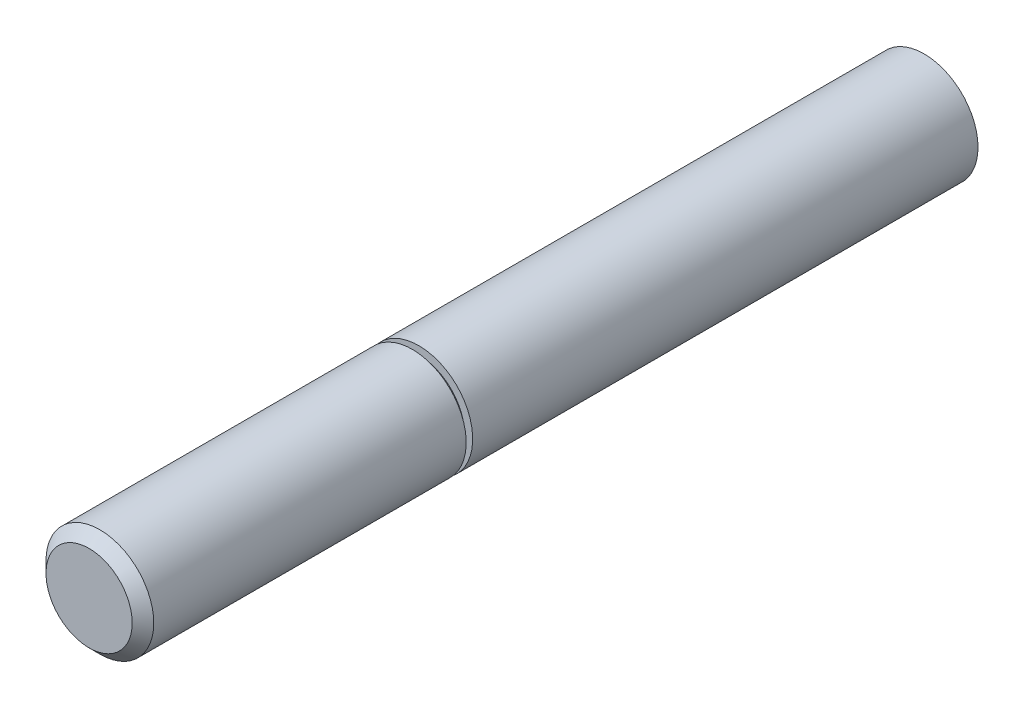
ISO-10303-21;
HEADER;
FILE_DESCRIPTION(('STEP AP214'),'2;1');
FILE_NAME('part.step','',(''),(''),'','','');
FILE_SCHEMA(('AUTOMOTIVE_DESIGN { 1 0 10303 214 1 1 1 1 }'));
ENDSEC;
DATA;
#1=APPLICATION_CONTEXT('core data for automotive mechanical design processes');
#2=APPLICATION_PROTOCOL_DEFINITION('international standard','automotive_design',2000,#1);
#3=PRODUCT_CONTEXT('',#1,'mechanical');
#4=PRODUCT('Part','Part','',(#3));
#5=PRODUCT_RELATED_PRODUCT_CATEGORY('part','',(#4));
#6=PRODUCT_DEFINITION_FORMATION('','',#4);
#7=PRODUCT_DEFINITION_CONTEXT('part definition',#1,'design');
#8=PRODUCT_DEFINITION('design','',#6,#7);
#9=PRODUCT_DEFINITION_SHAPE('','',#8);
#10=(LENGTH_UNIT() NAMED_UNIT(*) SI_UNIT(.MILLI.,.METRE.));
#11=(NAMED_UNIT(*) PLANE_ANGLE_UNIT() SI_UNIT($,.RADIAN.));
#12=(NAMED_UNIT(*) SI_UNIT($,.STERADIAN.) SOLID_ANGLE_UNIT());
#13=UNCERTAINTY_MEASURE_WITH_UNIT(LENGTH_MEASURE(1.E-05),#10,'distance_accuracy_value','');
#14=(GEOMETRIC_REPRESENTATION_CONTEXT(3) GLOBAL_UNCERTAINTY_ASSIGNED_CONTEXT((#13)) GLOBAL_UNIT_ASSIGNED_CONTEXT((#10,
#11,#12)) REPRESENTATION_CONTEXT('',''));
#15=CARTESIAN_POINT('',(0.,0.,0.));
#16=DIRECTION('',(0.,0.,1.));
#17=DIRECTION('',(1.,0.,0.));
#18=AXIS2_PLACEMENT_3D('',#15,#16,#17);
#19=CARTESIAN_POINT('',(0.,0.,155.));
#20=DIRECTION('',(0.,0.,-1.));
#21=DIRECTION('',(-1.,0.,0.));
#22=AXIS2_PLACEMENT_3D('',#19,#20,#21);
#23=CYLINDRICAL_SURFACE('',#22,10.);
#24=CARTESIAN_POINT('',(0.,0.,95.));
#25=DIRECTION('',(0.,0.,-1.));
#26=DIRECTION('',(-1.,0.,0.));
#27=AXIS2_PLACEMENT_3D('',#24,#25,#26);
#28=CIRCLE('',#27,10.);
#29=CARTESIAN_POINT('',(-10.,0.,95.));
#30=VERTEX_POINT('',#29);
#31=EDGE_CURVE('E68',#30,#30,#28,.T.);
#32=ORIENTED_EDGE('',*,*,#31,.F.);
#33=EDGE_LOOP('',(#32));
#34=FACE_BOUND('',#33,.T.);
#35=CARTESIAN_POINT('',(0.,0.,153.));
#36=DIRECTION('',(0.,0.,1.));
#37=DIRECTION('',(1.,0.,0.));
#38=AXIS2_PLACEMENT_3D('',#35,#36,#37);
#39=CIRCLE('',#38,10.);
#40=CARTESIAN_POINT('',(10.,0.,153.));
#41=VERTEX_POINT('',#40);
#42=EDGE_CURVE('E10',#41,#41,#39,.F.);
#43=ORIENTED_EDGE('',*,*,#42,.T.);
#44=EDGE_LOOP('',(#43));
#45=FACE_BOUND('',#44,.T.);
#46=ADVANCED_FACE('F45',(#34,#45),#23,.T.);
#47=CARTESIAN_POINT('',(0.,0.,155.));
#48=DIRECTION('',(0.,0.,1.));
#49=DIRECTION('',(1.,0.,0.));
#50=AXIS2_PLACEMENT_3D('',#47,#48,#49);
#51=PLANE('',#50);
#52=CARTESIAN_POINT('',(0.,0.,155.));
#53=DIRECTION('',(0.,0.,1.));
#54=DIRECTION('',(1.,0.,0.));
#55=AXIS2_PLACEMENT_3D('',#52,#53,#54);
#56=CIRCLE('',#55,8.00000000000005);
#57=CARTESIAN_POINT('',(8.00000000000005,0.,155.));
#58=VERTEX_POINT('',#57);
#59=EDGE_CURVE('E54',#58,#58,#56,.T.);
#60=ORIENTED_EDGE('',*,*,#59,.T.);
#61=EDGE_LOOP('',(#60));
#62=FACE_BOUND('',#61,.T.);
#63=ADVANCED_FACE('F112',(#62),#51,.T.);
#64=CARTESIAN_POINT('',(0.,0.,155.));
#65=DIRECTION('',(0.,0.,-1.));
#66=DIRECTION('',(-1.,0.,0.));
#67=AXIS2_PLACEMENT_3D('',#64,#65,#66);
#68=CONICAL_SURFACE('',#67,8.00000000000005,0.785398163397443);
#69=ORIENTED_EDGE('',*,*,#42,.F.);
#70=EDGE_LOOP('',(#69));
#71=FACE_BOUND('',#70,.T.);
#72=ORIENTED_EDGE('',*,*,#59,.F.);
#73=EDGE_LOOP('',(#72));
#74=FACE_BOUND('',#73,.T.);
#75=ADVANCED_FACE('F48',(#71,#74),#68,.T.);
#76=CARTESIAN_POINT('',(10.,0.,95.));
#77=DIRECTION('',(0.,0.,1.));
#78=DIRECTION('',(1.,0.,0.));
#79=AXIS2_PLACEMENT_3D('',#76,#77,#78);
#80=PLANE('',#79);
#81=CARTESIAN_POINT('',(0.,0.,95.));
#82=DIRECTION('',(0.,0.,-1.));
#83=DIRECTION('',(-1.,0.,0.));
#84=AXIS2_PLACEMENT_3D('',#81,#82,#83);
#85=CIRCLE('',#84,8.50000000000001);
#86=CARTESIAN_POINT('',(-8.50000000000001,0.,95.));
#87=VERTEX_POINT('',#86);
#88=EDGE_CURVE('E74',#87,#87,#85,.T.);
#89=ORIENTED_EDGE('',*,*,#88,.F.);
#90=EDGE_LOOP('',(#89));
#91=FACE_BOUND('',#90,.T.);
#92=ORIENTED_EDGE('',*,*,#31,.T.);
#93=EDGE_LOOP('',(#92));
#94=FACE_BOUND('',#93,.T.);
#95=ADVANCED_FACE('F102',(#91,#94),#80,.F.);
#96=CARTESIAN_POINT('',(0.,0.,0.));
#97=DIRECTION('',(0.,0.,-1.));
#98=DIRECTION('',(-1.,0.,0.));
#99=AXIS2_PLACEMENT_3D('',#96,#97,#98);
#100=CYLINDRICAL_SURFACE('',#99,8.50000000000001);
#101=CARTESIAN_POINT('',(0.,0.,93.8));
#102=DIRECTION('',(0.,0.,-1.));
#103=DIRECTION('',(-1.,0.,0.));
#104=AXIS2_PLACEMENT_3D('',#101,#102,#103);
#105=CIRCLE('',#104,8.50000000000001);
#106=CARTESIAN_POINT('',(-8.50000000000001,0.,93.8));
#107=VERTEX_POINT('',#106);
#108=EDGE_CURVE('E78',#107,#107,#105,.T.);
#109=ORIENTED_EDGE('',*,*,#108,.F.);
#110=EDGE_LOOP('',(#109));
#111=FACE_BOUND('',#110,.T.);
#112=ORIENTED_EDGE('',*,*,#88,.T.);
#113=EDGE_LOOP('',(#112));
#114=FACE_BOUND('',#113,.T.);
#115=ADVANCED_FACE('F96',(#111,#114),#100,.T.);
#116=CARTESIAN_POINT('',(8.50000000000001,0.,93.8));
#117=DIRECTION('',(0.,0.,-1.));
#118=DIRECTION('',(-1.,0.,0.));
#119=AXIS2_PLACEMENT_3D('',#116,#117,#118);
#120=PLANE('',#119);
#121=CARTESIAN_POINT('',(0.,0.,93.8));
#122=DIRECTION('',(0.,0.,-1.));
#123=DIRECTION('',(-1.,0.,0.));
#124=AXIS2_PLACEMENT_3D('',#121,#122,#123);
#125=CIRCLE('',#124,10.);
#126=CARTESIAN_POINT('',(-10.,0.,93.8));
#127=VERTEX_POINT('',#126);
#128=EDGE_CURVE('E82',#127,#127,#125,.T.);
#129=ORIENTED_EDGE('',*,*,#128,.F.);
#130=EDGE_LOOP('',(#129));
#131=FACE_BOUND('',#130,.T.);
#132=ORIENTED_EDGE('',*,*,#108,.T.);
#133=EDGE_LOOP('',(#132));
#134=FACE_BOUND('',#133,.T.);
#135=ADVANCED_FACE('F92',(#131,#134),#120,.F.);
#136=CARTESIAN_POINT('',(0.,0.,0.));
#137=DIRECTION('',(0.,0.,1.));
#138=DIRECTION('',(1.,0.,0.));
#139=AXIS2_PLACEMENT_3D('',#136,#137,#138);
#140=PLANE('',#139);
#141=CARTESIAN_POINT('',(0.,0.,0.));
#142=DIRECTION('',(0.,0.,1.));
#143=DIRECTION('',(1.,0.,0.));
#144=AXIS2_PLACEMENT_3D('',#141,#142,#143);
#145=CIRCLE('',#144,10.);
#146=CARTESIAN_POINT('',(10.,0.,0.));
#147=VERTEX_POINT('',#146);
#148=EDGE_CURVE('E61',#147,#147,#145,.T.);
#149=ORIENTED_EDGE('',*,*,#148,.F.);
#150=EDGE_LOOP('',(#149));
#151=FACE_BOUND('',#150,.T.);
#152=ADVANCED_FACE('F95',(#151),#140,.F.);
#153=ORIENTED_EDGE('',*,*,#128,.T.);
#154=EDGE_LOOP('',(#153));
#155=FACE_BOUND('',#154,.T.);
#156=ORIENTED_EDGE('',*,*,#148,.T.);
#157=EDGE_LOOP('',(#156));
#158=FACE_BOUND('',#157,.T.);
#159=ADVANCED_FACE('F89',(#155,#158),#23,.T.);
#160=CLOSED_SHELL('',(#46,#63,#75,#95,#115,#135,#152,#159));
#161=MANIFOLD_SOLID_BREP('B2',#160);
#162=ADVANCED_BREP_SHAPE_REPRESENTATION('',(#18,#161),#14);
#163=SHAPE_DEFINITION_REPRESENTATION(#9,#162);
ENDSEC;
END-ISO-10303-21;
